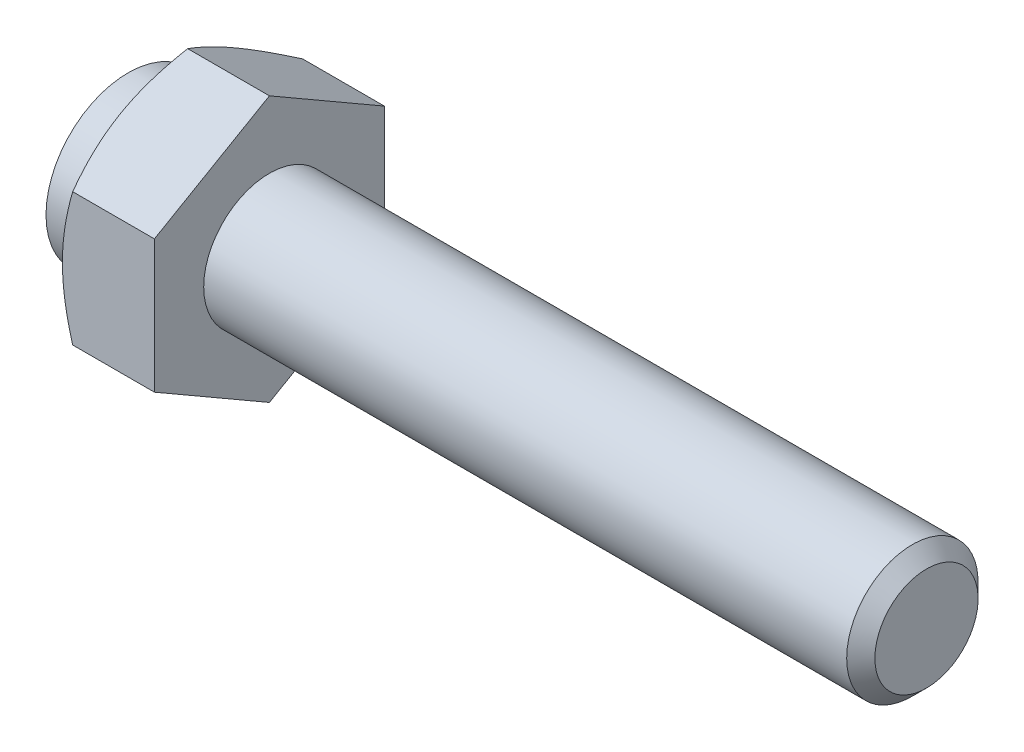
ISO-10303-21;
HEADER;
FILE_DESCRIPTION(('STEP AP214'),'2;1');
FILE_NAME('part.step','',(''),(''),'','','');
FILE_SCHEMA(('AUTOMOTIVE_DESIGN { 1 0 10303 214 1 1 1 1 }'));
ENDSEC;
DATA;
#1=APPLICATION_CONTEXT('core data for automotive mechanical design processes');
#2=APPLICATION_PROTOCOL_DEFINITION('international standard','automotive_design',2000,#1);
#3=PRODUCT_CONTEXT('',#1,'mechanical');
#4=PRODUCT('Part','Part','',(#3));
#5=PRODUCT_RELATED_PRODUCT_CATEGORY('part','',(#4));
#6=PRODUCT_DEFINITION_FORMATION('','',#4);
#7=PRODUCT_DEFINITION_CONTEXT('part definition',#1,'design');
#8=PRODUCT_DEFINITION('design','',#6,#7);
#9=PRODUCT_DEFINITION_SHAPE('','',#8);
#10=(LENGTH_UNIT() NAMED_UNIT(*) SI_UNIT(.MILLI.,.METRE.));
#11=(NAMED_UNIT(*) PLANE_ANGLE_UNIT() SI_UNIT($,.RADIAN.));
#12=(NAMED_UNIT(*) SI_UNIT($,.STERADIAN.) SOLID_ANGLE_UNIT());
#13=UNCERTAINTY_MEASURE_WITH_UNIT(LENGTH_MEASURE(1.E-05),#10,'distance_accuracy_value','');
#14=(GEOMETRIC_REPRESENTATION_CONTEXT(3) GLOBAL_UNCERTAINTY_ASSIGNED_CONTEXT((#13)) GLOBAL_UNIT_ASSIGNED_CONTEXT((#10,
#11,#12)) REPRESENTATION_CONTEXT('',''));
#15=CARTESIAN_POINT('',(0.,0.,0.));
#16=DIRECTION('',(0.,0.,1.));
#17=DIRECTION('',(1.,0.,0.));
#18=AXIS2_PLACEMENT_3D('',#15,#16,#17);
#19=CARTESIAN_POINT('',(-2.39585481156726,0.,0.));
#20=DIRECTION('',(1.,0.,0.));
#21=DIRECTION('',(0.,0.,-1.));
#22=AXIS2_PLACEMENT_3D('',#19,#20,#21);
#23=CONICAL_SURFACE('',#22,4.2,1.0471975511966);
#24=CARTESIAN_POINT('',(-1.11901191374015,-5.37196986632305,-3.5));
#25=CARTESIAN_POINT('',(-1.19271649121321,-5.21956229872807,-3.5));
#26=CARTESIAN_POINT('',(-1.26569797137802,-5.06679879227545,-3.5));
#27=CARTESIAN_POINT('',(-1.40980688021293,-4.76037039498441,-3.5));
#28=CARTESIAN_POINT('',(-1.4809340050989,-4.60670536144476,-3.5));
#29=CARTESIAN_POINT('',(-1.62129626461678,-4.29746545873837,-3.5));
#30=CARTESIAN_POINT('',(-1.69051848589423,-4.14188470744051,-3.5));
#31=CARTESIAN_POINT('',(-1.82605429448162,-3.82946600083053,-3.5));
#32=CARTESIAN_POINT('',(-1.89236802315746,-3.67262810706043,-3.5));
#33=CARTESIAN_POINT('',(-2.0232981051044,-3.35260353945911,-3.5));
#34=CARTESIAN_POINT('',(-2.08779991370498,-3.18936973939843,-3.5));
#35=CARTESIAN_POINT('',(-2.21178485329383,-2.8609718128924,-3.5));
#36=CARTESIAN_POINT('',(-2.27126741329966,-2.69580746925786,-3.5));
#37=CARTESIAN_POINT('',(-2.3836111685901,-2.36361344486694,-3.5));
#38=CARTESIAN_POINT('',(-2.43648626794416,-2.19658851504802,-3.5));
#39=CARTESIAN_POINT('',(-2.53388160750053,-1.860143848,-3.5));
#40=CARTESIAN_POINT('',(-2.57840453942322,-1.69072490130334,-3.5));
#41=CARTESIAN_POINT('',(-2.65668874987123,-1.35032578084445,-3.5));
#42=CARTESIAN_POINT('',(-2.69050625247354,-1.17935878378483,-3.5));
#43=CARTESIAN_POINT('',(-2.7454299454845,-0.835358711580522,-3.5));
#44=CARTESIAN_POINT('',(-2.76653722800651,-0.662325815249527,-3.5));
#45=CARTESIAN_POINT('',(-2.79407939926803,-0.317293925963925,-3.5));
#46=CARTESIAN_POINT('',(-2.80069844646934,-0.145310003142864,-3.5));
#47=CARTESIAN_POINT('',(-2.79918442101375,0.198604964977064,-3.5));
#48=CARTESIAN_POINT('',(-2.79105094478675,0.370536008700682,-3.5));
#49=CARTESIAN_POINT('',(-2.76513400901782,0.664116489402587,-3.5));
#50=CARTESIAN_POINT('',(-2.75077510101717,0.786085309438428,-3.5));
#51=CARTESIAN_POINT('',(-2.71555791787667,1.02908758010431,-3.5));
#52=CARTESIAN_POINT('',(-2.69469871046115,1.15012089401034,-3.5));
#53=CARTESIAN_POINT('',(-2.62347160339958,1.51168058473927,-3.5));
#54=CARTESIAN_POINT('',(-2.56446859449187,1.75052251621996,-3.5));
#55=CARTESIAN_POINT('',(-2.46269953025706,2.10757914173379,-3.5));
#56=CARTESIAN_POINT('',(-2.42610626368461,2.22765807986731,-3.5));
#57=CARTESIAN_POINT('',(-2.34925492112868,2.46664869406854,-3.5));
#58=CARTESIAN_POINT('',(-2.30899682177575,2.58556036268758,-3.5));
#59=CARTESIAN_POINT('',(-2.2254505158817,2.82225678707793,-3.5));
#60=CARTESIAN_POINT('',(-2.18216339811006,2.94004193064584,-3.5));
#61=CARTESIAN_POINT('',(-2.09305445810527,3.17464554572881,-3.5));
#62=CARTESIAN_POINT('',(-2.04723265930159,3.29146402616781,-3.5));
#63=CARTESIAN_POINT('',(-1.94042040946596,3.55666494412484,-3.5));
#64=CARTESIAN_POINT('',(-1.87875964823046,3.70477685888707,-3.5));
#65=CARTESIAN_POINT('',(-1.75267663962614,3.99982322200437,-3.5));
#66=CARTESIAN_POINT('',(-1.68825425902326,4.14675761314308,-3.5));
#67=CARTESIAN_POINT('',(-1.49165858602622,4.58612473076337,-3.5));
#68=CARTESIAN_POINT('',(-1.35617581127558,4.87707514102806,-3.5));
#69=CARTESIAN_POINT('',(-1.07923963317646,5.45640845489744,-3.5));
#70=CARTESIAN_POINT('',(-0.937781044230276,5.74478885423414,-3.5));
#71=CARTESIAN_POINT('',(-0.65077460696037,6.31951440902777,-3.5));
#72=CARTESIAN_POINT('',(-0.505226623296238,6.60585949673121,-3.5));
#73=CARTESIAN_POINT('',(-0.222655940337942,7.15478235363293,-3.5));
#74=CARTESIAN_POINT('',(-0.0858526890519785,7.41747346198052,-3.5));
#75=CARTESIAN_POINT('',(0.189646373453242,7.94187006515258,-3.5));
#76=CARTESIAN_POINT('',(0.328342239767763,8.20357553100015,-3.5));
#77=CARTESIAN_POINT('',(0.606880997808639,8.72563501839553,-3.5));
#78=CARTESIAN_POINT('',(0.74672069593945,8.98599074633556,-3.5));
#79=CARTESIAN_POINT('',(1.02754959638332,9.506065344426,-3.5));
#80=CARTESIAN_POINT('',(1.16853874214417,9.76578424509991,-3.5));
#81=CARTESIAN_POINT('',(1.30996058564117,10.0252656776079,-3.5));
#82=B_SPLINE_CURVE_WITH_KNOTS('',3,(#24,#25,#26,#27,#28,#29,#30,#31,#32,#33,#34,#35,#36,#37,#38,
#39,#40,#41,#42,#43,#44,#45,#46,#47,#48,#49,#50,#51,#52,#53,#54,#55,#56,#57,#58,#59,#60,#61,#62,
#63,#64,#65,#66,#67,#68,#69,#70,#71,#72,#73,#74,#75,#76,#77,#78,#79,#80,#81),.UNSPECIFIED.,.F.,
.F.,(4,2,2,2,2,2,2,2,2,2,2,2,2,2,2,2,2,2,2,2,2,2,2,2,2,2,2,2,4),(0.,0.507888246703564,
1.01585918038804,1.52669129945674,2.03749856219543,2.56398187130407,3.09052499187288,
3.61594075148652,4.1411868891234,4.66362686194865,5.18602193821682,5.70173737934552,
6.21746692860129,6.58572052685437,6.95402696451952,7.69107260984486,8.06763539279986,
8.44420057714207,8.82063109500091,9.19705813388495,9.6783243792878,10.1596138695236,
11.1223428649373,12.0859251699099,13.0495394027373,13.9380661095811,14.8266187374343,
15.7132171301892,16.5997721628952),.UNSPECIFIED.);
#83=CARTESIAN_POINT('',(-2.48739260883036,-2.02072594216369,-3.5));
#84=VERTEX_POINT('',#83);
#85=CARTESIAN_POINT('',(-2.8,0.,-3.5));
#86=VERTEX_POINT('',#85);
#87=EDGE_CURVE('E203',#84,#86,#82,.T.);
#88=ORIENTED_EDGE('',*,*,#87,.F.);
#89=CARTESIAN_POINT('',(-2.48732593930663,-4.04156735438122,0.000200000000000017));
#90=CARTESIAN_POINT('',(-2.53861421101002,-3.9527667384984,-0.15360717845245));
#91=CARTESIAN_POINT('',(-2.5852590461838,-3.86319960126198,-0.308742010834424));
#92=CARTESIAN_POINT('',(-2.66667812446665,-3.68251437287562,-0.621698006576782));
#93=CARTESIAN_POINT('',(-2.70142356441544,-3.59139307116725,-0.779524730787496));
#94=CARTESIAN_POINT('',(-2.75550997281716,-3.41027974688034,-1.09322221038013));
#95=CARTESIAN_POINT('',(-2.77521091373962,-3.32031559103708,-1.24904469916069));
#96=CARTESIAN_POINT('',(-2.79872986726275,-3.13996396008051,-1.56142288720538));
#97=CARTESIAN_POINT('',(-2.80256735545444,-3.04957714051106,-1.71797745103423));
#98=CARTESIAN_POINT('',(-2.79458469812302,-2.88068384499777,-2.01050921992099));
#99=CARTESIAN_POINT('',(-2.78472456593039,-2.80215208834114,-2.14653021245791));
#100=CARTESIAN_POINT('',(-2.7534735331006,-2.64560020969753,-2.417686020289));
#101=CARTESIAN_POINT('',(-2.7320719567142,-2.56758062920649,-2.55281989768468));
#102=CARTESIAN_POINT('',(-2.67856959211942,-2.41070596159678,-2.82453479240518));
#103=CARTESIAN_POINT('',(-2.64624200555491,-2.33187072981463,-2.96108141927834));
#104=CARTESIAN_POINT('',(-2.57287106619201,-2.17537608630783,-3.2321380929445));
#105=CARTESIAN_POINT('',(-2.53184495343013,-2.09771466960098,-3.36665161246854));
#106=CARTESIAN_POINT('',(-2.48732593930663,-2.02061047210985,-3.5002));
#107=B_SPLINE_CURVE_WITH_KNOTS('',3,(#89,#90,#91,#92,#93,#94,#95,#96,#97,#98,#99,#100,#101,#102,
#103,#104,#105,#106),.UNSPECIFIED.,.F.,.F.,(4,2,2,2,2,2,2,2,4),(0.,0.554793832886254,
1.11092123814984,1.65328467083219,2.19498204478403,2.6666513085086,3.13875761298267,
3.6213361260051,4.10296698719187),.UNSPECIFIED.);
#108=CARTESIAN_POINT('',(-2.8,-3.03108891324554,-1.75));
#109=VERTEX_POINT('',#108);
#110=EDGE_CURVE('E182',#109,#84,#107,.T.);
#111=ORIENTED_EDGE('',*,*,#110,.F.);
#112=CARTESIAN_POINT('',(-2.8,0.,0.));
#113=DIRECTION('',(-1.,0.,0.));
#114=DIRECTION('',(0.,0.,1.));
#115=AXIS2_PLACEMENT_3D('',#112,#113,#114);
#116=CIRCLE('',#115,3.5);
#117=EDGE_CURVE('E288',#86,#109,#116,.T.);
#118=ORIENTED_EDGE('',*,*,#117,.F.);
#119=EDGE_LOOP('',(#88,#111,#118));
#120=FACE_BOUND('',#119,.T.);
#121=ADVANCED_FACE('F38',(#120),#23,.T.);
#122=CARTESIAN_POINT('',(-2.48739260883036,2.02072594216369,-3.5));
#123=VERTEX_POINT('',#122);
#124=EDGE_CURVE('E189',#86,#123,#82,.T.);
#125=ORIENTED_EDGE('',*,*,#124,.F.);
#126=CARTESIAN_POINT('',(-2.8,3.03108891324554,-1.75));
#127=VERTEX_POINT('',#126);
#128=EDGE_CURVE('E287',#127,#86,#116,.T.);
#129=ORIENTED_EDGE('',*,*,#128,.F.);
#130=CARTESIAN_POINT('',(-2.48732593930663,2.02061047210985,-3.5002));
#131=CARTESIAN_POINT('',(-2.53861421101002,2.10941108799267,-3.34639282154755));
#132=CARTESIAN_POINT('',(-2.5852590461838,2.19897822522909,-3.19125798916558));
#133=CARTESIAN_POINT('',(-2.66667812446665,2.37966345361545,-2.87830199342322));
#134=CARTESIAN_POINT('',(-2.70142356441544,2.47078475532382,-2.7204752692125));
#135=CARTESIAN_POINT('',(-2.75550997281716,2.65189807961074,-2.40677778961987));
#136=CARTESIAN_POINT('',(-2.77521091373962,2.74186223545399,-2.25095530083931));
#137=CARTESIAN_POINT('',(-2.79872986726275,2.92221386641056,-1.93857711279463));
#138=CARTESIAN_POINT('',(-2.80256735545444,3.01260068598001,-1.78202254896577));
#139=CARTESIAN_POINT('',(-2.79458469812302,3.1814939814933,-1.48949078007901));
#140=CARTESIAN_POINT('',(-2.78472456593039,3.26002573814993,-1.35346978754209));
#141=CARTESIAN_POINT('',(-2.7534735331006,3.41657761679354,-1.082313979711));
#142=CARTESIAN_POINT('',(-2.7320719567142,3.49459719728458,-0.947180102315317));
#143=CARTESIAN_POINT('',(-2.67856959211942,3.65147186489429,-0.675465207594816));
#144=CARTESIAN_POINT('',(-2.64624200555491,3.73030709667644,-0.538918580721665));
#145=CARTESIAN_POINT('',(-2.57287106619201,3.88680174018324,-0.267861907055499));
#146=CARTESIAN_POINT('',(-2.53184495343013,3.96446315689009,-0.133348387531464));
#147=CARTESIAN_POINT('',(-2.48732593930663,4.04156735438122,0.000199999999999618));
#148=B_SPLINE_CURVE_WITH_KNOTS('',3,(#130,#131,#132,#133,#134,#135,#136,#137,#138,#139,#140,
#141,#142,#143,#144,#145,#146,#147),.UNSPECIFIED.,.F.,.F.,(4,2,2,2,2,2,2,2,4),(0.,
0.554793832886254,1.11092123814984,1.65328467083219,2.19498204478403,2.6666513085086,
3.13875761298267,3.6213361260051,4.10296698719187),.UNSPECIFIED.);
#149=EDGE_CURVE('E202',#123,#127,#148,.T.);
#150=ORIENTED_EDGE('',*,*,#149,.F.);
#151=EDGE_LOOP('',(#125,#129,#150));
#152=FACE_BOUND('',#151,.T.);
#153=ADVANCED_FACE('F171',(#152),#23,.T.);
#154=CARTESIAN_POINT('',(-2.48739260883036,4.04145188432738,0.));
#155=VERTEX_POINT('',#154);
#156=EDGE_CURVE('E196',#127,#155,#148,.T.);
#157=ORIENTED_EDGE('',*,*,#156,.F.);
#158=CARTESIAN_POINT('',(-2.8,3.03108891324554,1.75));
#159=VERTEX_POINT('',#158);
#160=EDGE_CURVE('E263',#159,#127,#116,.T.);
#161=ORIENTED_EDGE('',*,*,#160,.F.);
#162=CARTESIAN_POINT('',(-2.48732593930663,4.04156735438122,-0.000200000000000017));
#163=CARTESIAN_POINT('',(-2.53861421101002,3.9527667384984,0.15360717845245));
#164=CARTESIAN_POINT('',(-2.5852590461838,3.86319960126198,0.308742010834424));
#165=CARTESIAN_POINT('',(-2.66667812446665,3.68251437287562,0.621698006576782));
#166=CARTESIAN_POINT('',(-2.70142356441544,3.59139307116725,0.779524730787496));
#167=CARTESIAN_POINT('',(-2.75550997281716,3.41027974688034,1.09322221038013));
#168=CARTESIAN_POINT('',(-2.77521091373962,3.32031559103708,1.24904469916069));
#169=CARTESIAN_POINT('',(-2.79872986726275,3.13996396008051,1.56142288720538));
#170=CARTESIAN_POINT('',(-2.80256735545444,3.04957714051106,1.71797745103423));
#171=CARTESIAN_POINT('',(-2.79458469812302,2.88068384499777,2.01050921992099));
#172=CARTESIAN_POINT('',(-2.78472456593039,2.80215208834114,2.14653021245791));
#173=CARTESIAN_POINT('',(-2.7534735331006,2.64560020969753,2.417686020289));
#174=CARTESIAN_POINT('',(-2.7320719567142,2.56758062920649,2.55281989768468));
#175=CARTESIAN_POINT('',(-2.67856959211942,2.41070596159678,2.82453479240518));
#176=CARTESIAN_POINT('',(-2.64624200555491,2.33187072981463,2.96108141927834));
#177=CARTESIAN_POINT('',(-2.57287106619201,2.17537608630783,3.2321380929445));
#178=CARTESIAN_POINT('',(-2.53184495343013,2.09771466960098,3.36665161246854));
#179=CARTESIAN_POINT('',(-2.48732593930663,2.02061047210985,3.5002));
#180=B_SPLINE_CURVE_WITH_KNOTS('',3,(#162,#163,#164,#165,#166,#167,#168,#169,#170,#171,#172,
#173,#174,#175,#176,#177,#178,#179),.UNSPECIFIED.,.F.,.F.,(4,2,2,2,2,2,2,2,4),(0.,
0.554793832886254,1.11092123814984,1.65328467083219,2.19498204478403,2.6666513085086,
3.13875761298267,3.6213361260051,4.10296698719187),.UNSPECIFIED.);
#181=EDGE_CURVE('E259',#155,#159,#180,.T.);
#182=ORIENTED_EDGE('',*,*,#181,.F.);
#183=EDGE_LOOP('',(#157,#161,#182));
#184=FACE_BOUND('',#183,.T.);
#185=ADVANCED_FACE('F285',(#184),#23,.T.);
#186=CARTESIAN_POINT('',(-2.48739260883036,-4.04145188432738,0.));
#187=VERTEX_POINT('',#186);
#188=EDGE_CURVE('E295',#187,#109,#107,.T.);
#189=ORIENTED_EDGE('',*,*,#188,.F.);
#190=CARTESIAN_POINT('',(-2.48732593930663,-2.02061047210985,3.5002));
#191=CARTESIAN_POINT('',(-2.53861421101002,-2.10941108799267,3.34639282154755));
#192=CARTESIAN_POINT('',(-2.5852590461838,-2.19897822522909,3.19125798916558));
#193=CARTESIAN_POINT('',(-2.66667812446665,-2.37966345361545,2.87830199342322));
#194=CARTESIAN_POINT('',(-2.70142356441544,-2.47078475532382,2.7204752692125));
#195=CARTESIAN_POINT('',(-2.75550997281716,-2.65189807961074,2.40677778961987));
#196=CARTESIAN_POINT('',(-2.77521091373962,-2.74186223545399,2.25095530083931));
#197=CARTESIAN_POINT('',(-2.79872986726275,-2.92221386641056,1.93857711279463));
#198=CARTESIAN_POINT('',(-2.80256735545444,-3.01260068598001,1.78202254896577));
#199=CARTESIAN_POINT('',(-2.79458469812302,-3.1814939814933,1.48949078007901));
#200=CARTESIAN_POINT('',(-2.78472456593039,-3.26002573814993,1.35346978754209));
#201=CARTESIAN_POINT('',(-2.7534735331006,-3.41657761679354,1.082313979711));
#202=CARTESIAN_POINT('',(-2.7320719567142,-3.49459719728458,0.947180102315317));
#203=CARTESIAN_POINT('',(-2.67856959211942,-3.65147186489429,0.675465207594816));
#204=CARTESIAN_POINT('',(-2.64624200555491,-3.73030709667644,0.538918580721665));
#205=CARTESIAN_POINT('',(-2.57287106619201,-3.88680174018324,0.267861907055499));
#206=CARTESIAN_POINT('',(-2.53184495343013,-3.96446315689009,0.133348387531464));
#207=CARTESIAN_POINT('',(-2.48732593930663,-4.04156735438122,-0.000199999999999618));
#208=B_SPLINE_CURVE_WITH_KNOTS('',3,(#190,#191,#192,#193,#194,#195,#196,#197,#198,#199,#200,
#201,#202,#203,#204,#205,#206,#207),.UNSPECIFIED.,.F.,.F.,(4,2,2,2,2,2,2,2,4),(0.,
0.554793832886254,1.11092123814984,1.65328467083219,2.19498204478403,2.6666513085086,
3.13875761298267,3.6213361260051,4.10296698719187),.UNSPECIFIED.);
#209=CARTESIAN_POINT('',(-2.8,-3.03108891324554,1.75));
#210=VERTEX_POINT('',#209);
#211=EDGE_CURVE('E113',#210,#187,#208,.T.);
#212=ORIENTED_EDGE('',*,*,#211,.F.);
#213=EDGE_CURVE('E290',#109,#210,#116,.T.);
#214=ORIENTED_EDGE('',*,*,#213,.F.);
#215=EDGE_LOOP('',(#189,#212,#214));
#216=FACE_BOUND('',#215,.T.);
#217=ADVANCED_FACE('F294',(#216),#23,.T.);
#218=CARTESIAN_POINT('',(-2.48739260883036,2.02072594216369,3.5));
#219=VERTEX_POINT('',#218);
#220=EDGE_CURVE('E204',#159,#219,#180,.T.);
#221=ORIENTED_EDGE('',*,*,#220,.F.);
#222=CARTESIAN_POINT('',(-2.8,0.,3.5));
#223=VERTEX_POINT('',#222);
#224=EDGE_CURVE('E261',#223,#159,#116,.T.);
#225=ORIENTED_EDGE('',*,*,#224,.F.);
#226=CARTESIAN_POINT('',(-1.11901191374015,-5.37196986632305,3.5));
#227=CARTESIAN_POINT('',(-1.19271649121321,-5.21956229872807,3.5));
#228=CARTESIAN_POINT('',(-1.26569797137802,-5.06679879227545,3.5));
#229=CARTESIAN_POINT('',(-1.40980688021293,-4.76037039498441,3.5));
#230=CARTESIAN_POINT('',(-1.4809340050989,-4.60670536144476,3.5));
#231=CARTESIAN_POINT('',(-1.62129626461678,-4.29746545873837,3.5));
#232=CARTESIAN_POINT('',(-1.69051848589423,-4.14188470744051,3.5));
#233=CARTESIAN_POINT('',(-1.82605429448162,-3.82946600083053,3.5));
#234=CARTESIAN_POINT('',(-1.89236802315746,-3.67262810706043,3.5));
#235=CARTESIAN_POINT('',(-2.0232981051044,-3.35260353945911,3.5));
#236=CARTESIAN_POINT('',(-2.08779991370498,-3.18936973939843,3.5));
#237=CARTESIAN_POINT('',(-2.21178485329383,-2.8609718128924,3.5));
#238=CARTESIAN_POINT('',(-2.27126741329966,-2.69580746925786,3.5));
#239=CARTESIAN_POINT('',(-2.3836111685901,-2.36361344486694,3.5));
#240=CARTESIAN_POINT('',(-2.43648626794416,-2.19658851504802,3.5));
#241=CARTESIAN_POINT('',(-2.53388160750053,-1.860143848,3.5));
#242=CARTESIAN_POINT('',(-2.57840453942322,-1.69072490130334,3.5));
#243=CARTESIAN_POINT('',(-2.65668874987123,-1.35032578084445,3.5));
#244=CARTESIAN_POINT('',(-2.69050625247354,-1.17935878378483,3.5));
#245=CARTESIAN_POINT('',(-2.7454299454845,-0.835358711580522,3.5));
#246=CARTESIAN_POINT('',(-2.76653722800651,-0.662325815249527,3.5));
#247=CARTESIAN_POINT('',(-2.79407939926803,-0.317293925963925,3.5));
#248=CARTESIAN_POINT('',(-2.80069844646934,-0.145310003142864,3.5));
#249=CARTESIAN_POINT('',(-2.79918442101375,0.198604964977064,3.5));
#250=CARTESIAN_POINT('',(-2.79105094478675,0.370536008700682,3.5));
#251=CARTESIAN_POINT('',(-2.76513400901782,0.664116489402587,3.5));
#252=CARTESIAN_POINT('',(-2.75077510101717,0.786085309438428,3.5));
#253=CARTESIAN_POINT('',(-2.71555791787667,1.02908758010431,3.5));
#254=CARTESIAN_POINT('',(-2.69469871046115,1.15012089401034,3.5));
#255=CARTESIAN_POINT('',(-2.62347160339958,1.51168058473927,3.5));
#256=CARTESIAN_POINT('',(-2.56446859449187,1.75052251621996,3.5));
#257=CARTESIAN_POINT('',(-2.46269953025706,2.10757914173379,3.5));
#258=CARTESIAN_POINT('',(-2.42610626368461,2.22765807986731,3.5));
#259=CARTESIAN_POINT('',(-2.34925492112868,2.46664869406854,3.5));
#260=CARTESIAN_POINT('',(-2.30899682177575,2.58556036268758,3.5));
#261=CARTESIAN_POINT('',(-2.2254505158817,2.82225678707793,3.5));
#262=CARTESIAN_POINT('',(-2.18216339811006,2.94004193064584,3.5));
#263=CARTESIAN_POINT('',(-2.09305445810527,3.17464554572881,3.5));
#264=CARTESIAN_POINT('',(-2.04723265930159,3.29146402616781,3.5));
#265=CARTESIAN_POINT('',(-1.94042040946596,3.55666494412484,3.5));
#266=CARTESIAN_POINT('',(-1.87875964823046,3.70477685888707,3.5));
#267=CARTESIAN_POINT('',(-1.75267663962614,3.99982322200437,3.5));
#268=CARTESIAN_POINT('',(-1.68825425902326,4.14675761314308,3.5));
#269=CARTESIAN_POINT('',(-1.49165858602622,4.58612473076337,3.5));
#270=CARTESIAN_POINT('',(-1.35617581127558,4.87707514102806,3.5));
#271=CARTESIAN_POINT('',(-1.07923963317646,5.45640845489744,3.5));
#272=CARTESIAN_POINT('',(-0.937781044230276,5.74478885423414,3.5));
#273=CARTESIAN_POINT('',(-0.65077460696037,6.31951440902777,3.5));
#274=CARTESIAN_POINT('',(-0.505226623296238,6.60585949673121,3.5));
#275=CARTESIAN_POINT('',(-0.222655940337942,7.15478235363293,3.5));
#276=CARTESIAN_POINT('',(-0.0858526890519785,7.41747346198052,3.5));
#277=CARTESIAN_POINT('',(0.189646373453242,7.94187006515258,3.5));
#278=CARTESIAN_POINT('',(0.328342239767763,8.20357553100015,3.5));
#279=CARTESIAN_POINT('',(0.606880997808639,8.72563501839553,3.5));
#280=CARTESIAN_POINT('',(0.74672069593945,8.98599074633556,3.5));
#281=CARTESIAN_POINT('',(1.02754959638332,9.506065344426,3.5));
#282=CARTESIAN_POINT('',(1.16853874214417,9.76578424509991,3.5));
#283=CARTESIAN_POINT('',(1.30996058564117,10.0252656776079,3.5));
#284=B_SPLINE_CURVE_WITH_KNOTS('',3,(#226,#227,#228,#229,#230,#231,#232,#233,#234,#235,#236,
#237,#238,#239,#240,#241,#242,#243,#244,#245,#246,#247,#248,#249,#250,#251,#252,#253,#254,#255,
#256,#257,#258,#259,#260,#261,#262,#263,#264,#265,#266,#267,#268,#269,#270,#271,#272,#273,#274,
#275,#276,#277,#278,#279,#280,#281,#282,#283),.UNSPECIFIED.,.F.,.F.,(4,2,2,2,2,2,2,2,2,2,2,2,2,
2,2,2,2,2,2,2,2,2,2,2,2,2,2,2,4),(0.,0.507888246703564,1.01585918038804,1.52669129945674,
2.03749856219543,2.56398187130407,3.09052499187288,3.61594075148652,4.1411868891234,
4.66362686194865,5.18602193821682,5.70173737934552,6.21746692860129,6.58572052685437,
6.95402696451952,7.69107260984486,8.06763539279986,8.44420057714207,8.82063109500091,
9.19705813388495,9.6783243792878,10.1596138695236,11.1223428649373,12.0859251699099,
13.0495394027373,13.9380661095811,14.8266187374343,15.7132171301892,16.5997721628952),.UNSPECIFIED.);
#285=EDGE_CURVE('E53',#219,#223,#284,.F.);
#286=ORIENTED_EDGE('',*,*,#285,.F.);
#287=EDGE_LOOP('',(#221,#225,#286));
#288=FACE_BOUND('',#287,.T.);
#289=ADVANCED_FACE('F280',(#288),#23,.T.);
#290=CARTESIAN_POINT('',(-2.48739260883036,-2.02072594216369,3.5));
#291=VERTEX_POINT('',#290);
#292=EDGE_CURVE('E296',#291,#210,#208,.T.);
#293=ORIENTED_EDGE('',*,*,#292,.F.);
#294=EDGE_CURVE('E145',#223,#291,#284,.F.);
#295=ORIENTED_EDGE('',*,*,#294,.F.);
#296=EDGE_CURVE('E256',#210,#223,#116,.T.);
#297=ORIENTED_EDGE('',*,*,#296,.F.);
#298=EDGE_LOOP('',(#293,#295,#297));
#299=FACE_BOUND('',#298,.T.);
#300=ADVANCED_FACE('F173',(#299),#23,.T.);
#301=CARTESIAN_POINT('',(-4.3,0.,0.));
#302=DIRECTION('',(1.,0.,0.));
#303=DIRECTION('',(0.,0.,-1.));
#304=AXIS2_PLACEMENT_3D('',#301,#302,#303);
#305=PLANE('',#304);
#306=CARTESIAN_POINT('',(-4.3,0.,0.));
#307=DIRECTION('',(-1.,0.,0.));
#308=DIRECTION('',(0.,0.,1.));
#309=AXIS2_PLACEMENT_3D('',#306,#307,#308);
#310=CIRCLE('',#309,2.5);
#311=CARTESIAN_POINT('',(-4.3,0.,2.5));
#312=VERTEX_POINT('',#311);
#313=EDGE_CURVE('E11',#312,#312,#310,.T.);
#314=ORIENTED_EDGE('',*,*,#313,.T.);
#315=EDGE_LOOP('',(#314));
#316=FACE_BOUND('',#315,.T.);
#317=ADVANCED_FACE('F40',(#316),#305,.F.);
#318=CARTESIAN_POINT('',(20.,0.,0.));
#319=DIRECTION('',(-1.,0.,0.));
#320=DIRECTION('',(0.,0.,1.));
#321=AXIS2_PLACEMENT_3D('',#318,#319,#320);
#322=CYLINDRICAL_SURFACE('',#321,2.5);
#323=ORIENTED_EDGE('',*,*,#313,.F.);
#324=EDGE_LOOP('',(#323));
#325=FACE_BOUND('',#324,.T.);
#326=CARTESIAN_POINT('',(-2.8,0.,0.));
#327=DIRECTION('',(-1.,0.,0.));
#328=DIRECTION('',(0.,0.,1.));
#329=AXIS2_PLACEMENT_3D('',#326,#327,#328);
#330=CIRCLE('',#329,2.5);
#331=CARTESIAN_POINT('',(-2.8,0.,2.5));
#332=VERTEX_POINT('',#331);
#333=EDGE_CURVE('E46',#332,#332,#330,.T.);
#334=ORIENTED_EDGE('',*,*,#333,.T.);
#335=EDGE_LOOP('',(#334));
#336=FACE_BOUND('',#335,.T.);
#337=ADVANCED_FACE('F267',(#325,#336),#322,.T.);
#338=CARTESIAN_POINT('',(-2.8,2.5,0.));
#339=DIRECTION('',(1.,0.,0.));
#340=DIRECTION('',(0.,0.,-1.));
#341=AXIS2_PLACEMENT_3D('',#338,#339,#340);
#342=PLANE('',#341);
#343=ORIENTED_EDGE('',*,*,#333,.F.);
#344=EDGE_LOOP('',(#343));
#345=FACE_BOUND('',#344,.T.);
#346=ORIENTED_EDGE('',*,*,#224,.T.);
#347=ORIENTED_EDGE('',*,*,#160,.T.);
#348=ORIENTED_EDGE('',*,*,#128,.T.);
#349=ORIENTED_EDGE('',*,*,#117,.T.);
#350=ORIENTED_EDGE('',*,*,#213,.T.);
#351=ORIENTED_EDGE('',*,*,#296,.T.);
#352=EDGE_LOOP('',(#346,#347,#348,#349,#350,#351));
#353=FACE_BOUND('',#352,.T.);
#354=ADVANCED_FACE('F175',(#345,#353),#342,.F.);
#355=CARTESIAN_POINT('',(-4.3,4.04145188432738,0.));
#356=DIRECTION('',(0.,0.866025403784439,0.5));
#357=DIRECTION('',(0.,-0.5,0.866025403784439));
#358=AXIS2_PLACEMENT_3D('',#355,#356,#357);
#359=PLANE('',#358);
#360=ORIENTED_EDGE('',*,*,#181,.T.);
#361=ORIENTED_EDGE('',*,*,#220,.T.);
#362=DIRECTION('',(1.,0.,0.));
#363=VECTOR('',#362,1.);
#364=CARTESIAN_POINT('',(-4.3,2.02072594216369,3.5));
#365=LINE('',#364,#363);
#366=CARTESIAN_POINT('',(0.,2.02072594216369,3.5));
#367=VERTEX_POINT('',#366);
#368=EDGE_CURVE('E142',#219,#367,#365,.T.);
#369=ORIENTED_EDGE('',*,*,#368,.T.);
#370=DIRECTION('',(0.,-0.5,0.866025403784439));
#371=VECTOR('',#370,1.);
#372=CARTESIAN_POINT('',(0.,4.04145188432738,0.));
#373=LINE('',#372,#371);
#374=CARTESIAN_POINT('',(0.,4.04145188432738,0.));
#375=VERTEX_POINT('',#374);
#376=EDGE_CURVE('E134',#375,#367,#373,.T.);
#377=ORIENTED_EDGE('',*,*,#376,.F.);
#378=DIRECTION('',(1.,0.,0.));
#379=VECTOR('',#378,1.);
#380=CARTESIAN_POINT('',(-4.3,4.04145188432738,0.));
#381=LINE('',#380,#379);
#382=EDGE_CURVE('E143',#155,#375,#381,.T.);
#383=ORIENTED_EDGE('',*,*,#382,.F.);
#384=EDGE_LOOP('',(#360,#361,#369,#377,#383));
#385=FACE_BOUND('',#384,.T.);
#386=ADVANCED_FACE('F214',(#385),#359,.T.);
#387=CARTESIAN_POINT('',(-4.3,2.02072594216369,-3.5));
#388=DIRECTION('',(0.,0.866025403784439,-0.5));
#389=DIRECTION('',(0.,0.5,0.866025403784439));
#390=AXIS2_PLACEMENT_3D('',#387,#388,#389);
#391=PLANE('',#390);
#392=ORIENTED_EDGE('',*,*,#149,.T.);
#393=ORIENTED_EDGE('',*,*,#156,.T.);
#394=ORIENTED_EDGE('',*,*,#382,.T.);
#395=DIRECTION('',(0.,0.5,0.866025403784439));
#396=VECTOR('',#395,1.);
#397=CARTESIAN_POINT('',(0.,2.02072594216369,-3.5));
#398=LINE('',#397,#396);
#399=CARTESIAN_POINT('',(0.,2.02072594216369,-3.5));
#400=VERTEX_POINT('',#399);
#401=EDGE_CURVE('E139',#400,#375,#398,.T.);
#402=ORIENTED_EDGE('',*,*,#401,.F.);
#403=DIRECTION('',(1.,0.,0.));
#404=VECTOR('',#403,1.);
#405=CARTESIAN_POINT('',(-4.3,2.02072594216369,-3.5));
#406=LINE('',#405,#404);
#407=EDGE_CURVE('E146',#123,#400,#406,.T.);
#408=ORIENTED_EDGE('',*,*,#407,.F.);
#409=EDGE_LOOP('',(#392,#393,#394,#402,#408));
#410=FACE_BOUND('',#409,.T.);
#411=ADVANCED_FACE('F210',(#410),#391,.T.);
#412=CARTESIAN_POINT('',(-4.3,-2.02072594216369,-3.5));
#413=DIRECTION('',(0.,0.,-1.));
#414=DIRECTION('',(-1.,0.,0.));
#415=AXIS2_PLACEMENT_3D('',#412,#413,#414);
#416=PLANE('',#415);
#417=ORIENTED_EDGE('',*,*,#87,.T.);
#418=ORIENTED_EDGE('',*,*,#124,.T.);
#419=ORIENTED_EDGE('',*,*,#407,.T.);
#420=DIRECTION('',(0.,1.,0.));
#421=VECTOR('',#420,1.);
#422=CARTESIAN_POINT('',(0.,-2.02072594216369,-3.5));
#423=LINE('',#422,#421);
#424=CARTESIAN_POINT('',(0.,-2.02072594216369,-3.5));
#425=VERTEX_POINT('',#424);
#426=EDGE_CURVE('E126',#425,#400,#423,.T.);
#427=ORIENTED_EDGE('',*,*,#426,.F.);
#428=DIRECTION('',(1.,0.,0.));
#429=VECTOR('',#428,1.);
#430=CARTESIAN_POINT('',(-4.3,-2.02072594216369,-3.5));
#431=LINE('',#430,#429);
#432=EDGE_CURVE('E116',#84,#425,#431,.T.);
#433=ORIENTED_EDGE('',*,*,#432,.F.);
#434=EDGE_LOOP('',(#417,#418,#419,#427,#433));
#435=FACE_BOUND('',#434,.T.);
#436=ADVANCED_FACE('F213',(#435),#416,.T.);
#437=CARTESIAN_POINT('',(-4.3,-4.04145188432738,0.));
#438=DIRECTION('',(0.,-0.866025403784439,-0.5));
#439=DIRECTION('',(0.,0.5,-0.866025403784439));
#440=AXIS2_PLACEMENT_3D('',#437,#438,#439);
#441=PLANE('',#440);
#442=ORIENTED_EDGE('',*,*,#188,.T.);
#443=ORIENTED_EDGE('',*,*,#110,.T.);
#444=ORIENTED_EDGE('',*,*,#432,.T.);
#445=DIRECTION('',(0.,0.5,-0.866025403784439));
#446=VECTOR('',#445,1.);
#447=CARTESIAN_POINT('',(0.,-4.04145188432738,0.));
#448=LINE('',#447,#446);
#449=CARTESIAN_POINT('',(0.,-4.04145188432738,0.));
#450=VERTEX_POINT('',#449);
#451=EDGE_CURVE('E120',#450,#425,#448,.T.);
#452=ORIENTED_EDGE('',*,*,#451,.F.);
#453=DIRECTION('',(1.,0.,0.));
#454=VECTOR('',#453,1.);
#455=CARTESIAN_POINT('',(-4.3,-4.04145188432738,0.));
#456=LINE('',#455,#454);
#457=EDGE_CURVE('E109',#187,#450,#456,.T.);
#458=ORIENTED_EDGE('',*,*,#457,.F.);
#459=EDGE_LOOP('',(#442,#443,#444,#452,#458));
#460=FACE_BOUND('',#459,.T.);
#461=ADVANCED_FACE('F121',(#460),#441,.T.);
#462=CARTESIAN_POINT('',(-4.3,-2.02072594216369,3.5));
#463=DIRECTION('',(0.,-0.866025403784439,0.5));
#464=DIRECTION('',(0.,-0.5,-0.866025403784439));
#465=AXIS2_PLACEMENT_3D('',#462,#463,#464);
#466=PLANE('',#465);
#467=ORIENTED_EDGE('',*,*,#292,.T.);
#468=ORIENTED_EDGE('',*,*,#211,.T.);
#469=ORIENTED_EDGE('',*,*,#457,.T.);
#470=DIRECTION('',(0.,-0.5,-0.866025403784439));
#471=VECTOR('',#470,1.);
#472=CARTESIAN_POINT('',(0.,-2.02072594216369,3.5));
#473=LINE('',#472,#471);
#474=CARTESIAN_POINT('',(0.,-2.02072594216369,3.5));
#475=VERTEX_POINT('',#474);
#476=EDGE_CURVE('E61',#475,#450,#473,.T.);
#477=ORIENTED_EDGE('',*,*,#476,.F.);
#478=DIRECTION('',(1.,0.,0.));
#479=VECTOR('',#478,1.);
#480=CARTESIAN_POINT('',(-4.3,-2.02072594216369,3.5));
#481=LINE('',#480,#479);
#482=EDGE_CURVE('E117',#291,#475,#481,.T.);
#483=ORIENTED_EDGE('',*,*,#482,.F.);
#484=EDGE_LOOP('',(#467,#468,#469,#477,#483));
#485=FACE_BOUND('',#484,.T.);
#486=ADVANCED_FACE('F111',(#485),#466,.T.);
#487=CARTESIAN_POINT('',(-4.3,2.02072594216369,3.5));
#488=DIRECTION('',(0.,0.,1.));
#489=DIRECTION('',(1.,0.,0.));
#490=AXIS2_PLACEMENT_3D('',#487,#488,#489);
#491=PLANE('',#490);
#492=ORIENTED_EDGE('',*,*,#285,.T.);
#493=ORIENTED_EDGE('',*,*,#294,.T.);
#494=ORIENTED_EDGE('',*,*,#482,.T.);
#495=DIRECTION('',(0.,-1.,0.));
#496=VECTOR('',#495,1.);
#497=CARTESIAN_POINT('',(0.,2.02072594216369,3.5));
#498=LINE('',#497,#496);
#499=EDGE_CURVE('E132',#367,#475,#498,.T.);
#500=ORIENTED_EDGE('',*,*,#499,.F.);
#501=ORIENTED_EDGE('',*,*,#368,.F.);
#502=EDGE_LOOP('',(#492,#493,#494,#500,#501));
#503=FACE_BOUND('',#502,.T.);
#504=ADVANCED_FACE('F164',(#503),#491,.T.);
#505=CARTESIAN_POINT('',(20.,1.5705,0.));
#506=DIRECTION('',(-1.,0.,0.));
#507=DIRECTION('',(0.,0.,1.));
#508=AXIS2_PLACEMENT_3D('',#505,#506,#507);
#509=PLANE('',#508);
#510=CARTESIAN_POINT('',(20.,0.,0.));
#511=DIRECTION('',(-1.,0.,0.));
#512=DIRECTION('',(0.,0.,1.));
#513=AXIS2_PLACEMENT_3D('',#510,#511,#512);
#514=CIRCLE('',#513,1.5705);
#515=CARTESIAN_POINT('',(20.,0.,1.5705));
#516=VERTEX_POINT('',#515);
#517=EDGE_CURVE('E254',#516,#516,#514,.T.);
#518=ORIENTED_EDGE('',*,*,#517,.F.);
#519=EDGE_LOOP('',(#518));
#520=FACE_BOUND('',#519,.T.);
#521=ADVANCED_FACE('F226',(#520),#509,.F.);
#522=CARTESIAN_POINT('',(20.,0.,0.));
#523=DIRECTION('',(-1.,0.,0.));
#524=DIRECTION('',(0.,0.,1.));
#525=AXIS2_PLACEMENT_3D('',#522,#523,#524);
#526=CONICAL_SURFACE('',#525,1.5705,0.785398163397449);
#527=CARTESIAN_POINT('',(19.5705,0.,0.));
#528=DIRECTION('',(-1.,0.,0.));
#529=DIRECTION('',(0.,0.,1.));
#530=AXIS2_PLACEMENT_3D('',#527,#528,#529);
#531=CIRCLE('',#530,2.);
#532=CARTESIAN_POINT('',(19.5705,0.,2.));
#533=VERTEX_POINT('',#532);
#534=EDGE_CURVE('E253',#533,#533,#531,.T.);
#535=ORIENTED_EDGE('',*,*,#534,.F.);
#536=EDGE_LOOP('',(#535));
#537=FACE_BOUND('',#536,.T.);
#538=ORIENTED_EDGE('',*,*,#517,.T.);
#539=EDGE_LOOP('',(#538));
#540=FACE_BOUND('',#539,.T.);
#541=ADVANCED_FACE('F230',(#537,#540),#526,.T.);
#542=CARTESIAN_POINT('',(20.,0.,0.));
#543=DIRECTION('',(-1.,0.,0.));
#544=DIRECTION('',(0.,0.,1.));
#545=AXIS2_PLACEMENT_3D('',#542,#543,#544);
#546=CYLINDRICAL_SURFACE('',#545,2.);
#547=CARTESIAN_POINT('',(0.,0.,0.));
#548=DIRECTION('',(-1.,0.,0.));
#549=DIRECTION('',(0.,0.,1.));
#550=AXIS2_PLACEMENT_3D('',#547,#548,#549);
#551=CIRCLE('',#550,2.);
#552=CARTESIAN_POINT('',(0.,0.,2.));
#553=VERTEX_POINT('',#552);
#554=EDGE_CURVE('E250',#553,#553,#551,.T.);
#555=ORIENTED_EDGE('',*,*,#554,.F.);
#556=EDGE_LOOP('',(#555));
#557=FACE_BOUND('',#556,.T.);
#558=ORIENTED_EDGE('',*,*,#534,.T.);
#559=EDGE_LOOP('',(#558));
#560=FACE_BOUND('',#559,.T.);
#561=ADVANCED_FACE('F236',(#557,#560),#546,.T.);
#562=CARTESIAN_POINT('',(0.,4.2,0.));
#563=DIRECTION('',(-1.,0.,0.));
#564=DIRECTION('',(0.,0.,1.));
#565=AXIS2_PLACEMENT_3D('',#562,#563,#564);
#566=PLANE('',#565);
#567=ORIENTED_EDGE('',*,*,#554,.T.);
#568=EDGE_LOOP('',(#567));
#569=FACE_BOUND('',#568,.T.);
#570=ORIENTED_EDGE('',*,*,#376,.T.);
#571=ORIENTED_EDGE('',*,*,#499,.T.);
#572=ORIENTED_EDGE('',*,*,#476,.T.);
#573=ORIENTED_EDGE('',*,*,#451,.T.);
#574=ORIENTED_EDGE('',*,*,#426,.T.);
#575=ORIENTED_EDGE('',*,*,#401,.T.);
#576=EDGE_LOOP('',(#570,#571,#572,#573,#574,#575));
#577=FACE_BOUND('',#576,.T.);
#578=ADVANCED_FACE('F130',(#569,#577),#566,.F.);
#579=CLOSED_SHELL('',(#121,#153,#185,#217,#289,#300,#317,#337,#354,#386,#411,#436,#461,#486,
#504,#521,#541,#561,#578));
#580=MANIFOLD_SOLID_BREP('B2',#579);
#581=ADVANCED_BREP_SHAPE_REPRESENTATION('',(#18,#580),#14);
#582=SHAPE_DEFINITION_REPRESENTATION(#9,#581);
ENDSEC;
END-ISO-10303-21;
